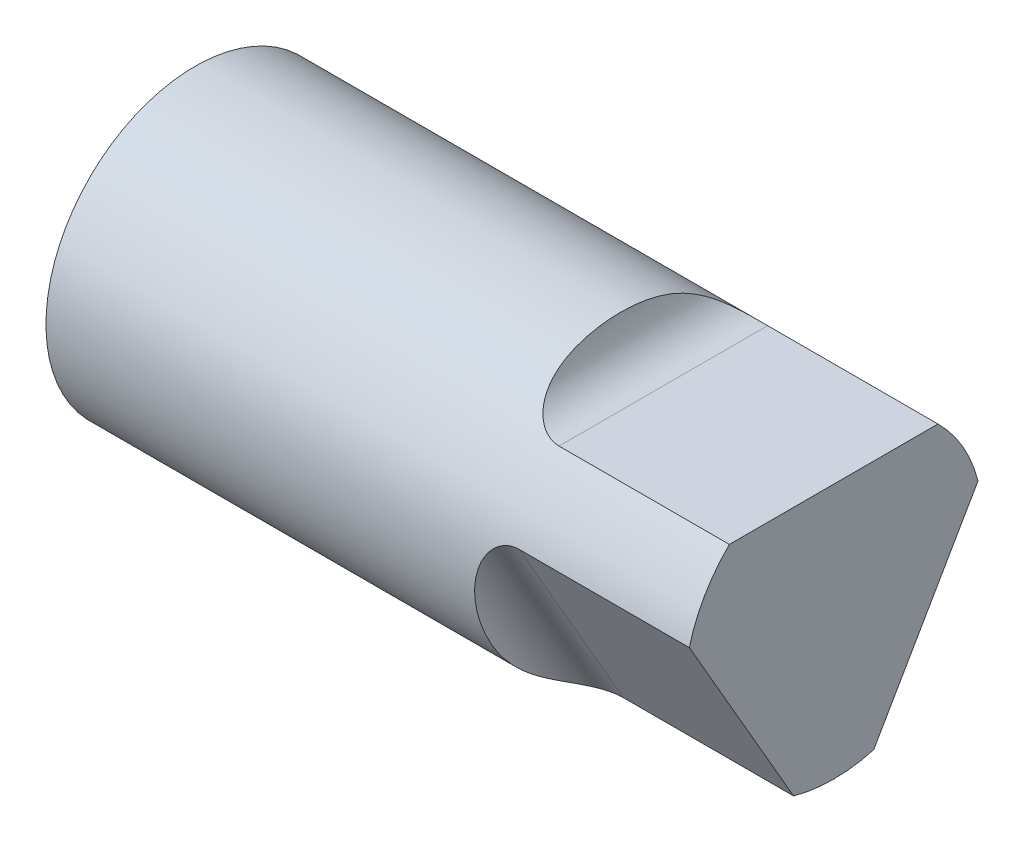
ISO-10303-21;
HEADER;
FILE_DESCRIPTION(('STEP AP214'),'2;1');
FILE_NAME('part.step','',(''),(''),'','','');
FILE_SCHEMA(('AUTOMOTIVE_DESIGN { 1 0 10303 214 1 1 1 1 }'));
ENDSEC;
DATA;
#1=APPLICATION_CONTEXT('core data for automotive mechanical design processes');
#2=APPLICATION_PROTOCOL_DEFINITION('international standard','automotive_design',2000,#1);
#3=PRODUCT_CONTEXT('',#1,'mechanical');
#4=PRODUCT('Part','Part','',(#3));
#5=PRODUCT_RELATED_PRODUCT_CATEGORY('part','',(#4));
#6=PRODUCT_DEFINITION_FORMATION('','',#4);
#7=PRODUCT_DEFINITION_CONTEXT('part definition',#1,'design');
#8=PRODUCT_DEFINITION('design','',#6,#7);
#9=PRODUCT_DEFINITION_SHAPE('','',#8);
#10=(LENGTH_UNIT() NAMED_UNIT(*) SI_UNIT(.MILLI.,.METRE.));
#11=(NAMED_UNIT(*) PLANE_ANGLE_UNIT() SI_UNIT($,.RADIAN.));
#12=(NAMED_UNIT(*) SI_UNIT($,.STERADIAN.) SOLID_ANGLE_UNIT());
#13=UNCERTAINTY_MEASURE_WITH_UNIT(LENGTH_MEASURE(1.E-05),#10,'distance_accuracy_value','');
#14=(GEOMETRIC_REPRESENTATION_CONTEXT(3) GLOBAL_UNCERTAINTY_ASSIGNED_CONTEXT((#13)) GLOBAL_UNIT_ASSIGNED_CONTEXT((#10,
#11,#12)) REPRESENTATION_CONTEXT('',''));
#15=CARTESIAN_POINT('',(0.,0.,0.));
#16=DIRECTION('',(0.,0.,1.));
#17=DIRECTION('',(1.,0.,0.));
#18=AXIS2_PLACEMENT_3D('',#15,#16,#17);
#19=CARTESIAN_POINT('',(60.,0.,0.));
#20=DIRECTION('',(-1.,0.,0.));
#21=DIRECTION('',(0.,0.,1.));
#22=AXIS2_PLACEMENT_3D('',#19,#20,#21);
#23=CYLINDRICAL_SURFACE('',#22,14.);
#24=CARTESIAN_POINT('',(60.,0.,0.));
#25=DIRECTION('',(1.,0.,0.));
#26=DIRECTION('',(0.,0.,-1.));
#27=AXIS2_PLACEMENT_3D('',#24,#25,#26);
#28=CIRCLE('',#27,14.);
#29=CARTESIAN_POINT('',(60.,3.4852813742387,-13.5592335234107));
#30=VERTEX_POINT('',#29);
#31=CARTESIAN_POINT('',(60.,10.,-9.79795897113271));
#32=VERTEX_POINT('',#31);
#33=EDGE_CURVE('E118',#30,#32,#28,.T.);
#34=ORIENTED_EDGE('',*,*,#33,.F.);
#35=DIRECTION('',(-1.,0.,0.));
#36=VECTOR('',#35,1.);
#37=CARTESIAN_POINT('',(60.,3.4852813742387,-13.5592335234107));
#38=LINE('',#37,#36);
#39=CARTESIAN_POINT('',(44.,3.4852813742387,-13.5592335234107));
#40=VERTEX_POINT('',#39);
#41=EDGE_CURVE('E104',#30,#40,#38,.T.);
#42=ORIENTED_EDGE('',*,*,#41,.T.);
#43=CARTESIAN_POINT('',(44.,3.4852813742387,-13.5592335234107));
#44=CARTESIAN_POINT('',(43.9141785661278,3.48530022696564,-13.5592215790291));
#45=CARTESIAN_POINT('',(43.8283678622463,3.48145968499757,-13.5602156867436));
#46=CARTESIAN_POINT('',(43.6575063420808,3.46620484786464,-13.5641268411452));
#47=CARTESIAN_POINT('',(43.572455183019,3.45479416441893,-13.5670429708301));
#48=CARTESIAN_POINT('',(43.4043028178066,3.42463973179134,-13.5746848565925));
#49=CARTESIAN_POINT('',(43.321192667003,3.40594293834388,-13.57939902108));
#50=CARTESIAN_POINT('',(43.1570116428121,3.36149896400591,-13.5904690336366));
#51=CARTESIAN_POINT('',(43.0759409141676,3.33575128422901,-13.5968249978695));
#52=CARTESIAN_POINT('',(42.8368904906767,3.2484987595283,-13.6180342809503));
#53=CARTESIAN_POINT('',(42.6826672315178,3.17690983155402,-13.6350489791986));
#54=CARTESIAN_POINT('',(42.3879020558571,3.01035620579662,-13.6727839427457));
#55=CARTESIAN_POINT('',(42.2473803553689,2.91535767542598,-13.693509559268));
#56=CARTESIAN_POINT('',(41.942799001477,2.67506144527775,-13.7427466435954));
#57=CARTESIAN_POINT('',(41.7840059495909,2.52319094390066,-13.7717526817161));
#58=CARTESIAN_POINT('',(41.4933693354007,2.1952751154083,-13.8278139457392));
#59=CARTESIAN_POINT('',(41.3615663836114,2.01919401566668,-13.8548661928651));
#60=CARTESIAN_POINT('',(41.1579456050866,1.70385208313112,-13.8965618144662));
#61=CARTESIAN_POINT('',(41.079820234268,1.568735719074,-13.9125279674854));
#62=CARTESIAN_POINT('',(40.9352492234473,1.2919861727716,-13.940950634657));
#63=CARTESIAN_POINT('',(40.8688085264248,1.15035026437093,-13.9534056648324));
#64=CARTESIAN_POINT('',(40.7464455239674,0.862180469434536,-13.974174253443));
#65=CARTESIAN_POINT('',(40.6905343593538,0.71564158613619,-13.9824834405062));
#66=CARTESIAN_POINT('',(40.5881072156868,0.419112652578941,-13.9945130537194));
#67=CARTESIAN_POINT('',(40.5415945411802,0.269121409032576,-13.9982318682159));
#68=CARTESIAN_POINT('',(40.4301144295634,-0.128420715093423,-14.0015749531419));
#69=CARTESIAN_POINT('',(40.3719691182032,-0.3779305429581,-13.9971463437073));
#70=CARTESIAN_POINT('',(40.2729708225424,-0.879759760654847,-13.9745932387166));
#71=CARTESIAN_POINT('',(40.2321288719285,-1.1320808382,-13.9564600247138));
#72=CARTESIAN_POINT('',(40.163650677574,-1.63820376406158,-13.9061587416218));
#73=CARTESIAN_POINT('',(40.1360732379485,-1.8920072478217,-13.8739293640238));
#74=CARTESIAN_POINT('',(40.0909944295142,-2.39827247829733,-13.7954309442507));
#75=CARTESIAN_POINT('',(40.073491988429,-2.65073436496361,-13.7491633969509));
#76=CARTESIAN_POINT('',(40.0496440015179,-3.08234531070486,-13.657715425773));
#77=CARTESIAN_POINT('',(40.041544680199,-3.26212404790898,-13.61589613173));
#78=CARTESIAN_POINT('',(40.0282051082732,-3.62000192737098,-13.5251492066459));
#79=CARTESIAN_POINT('',(40.0229650672703,-3.79810094555414,-13.4762210548115));
#80=CARTESIAN_POINT('',(40.0145774328555,-4.15234330135382,-13.3713195455525));
#81=CARTESIAN_POINT('',(40.0114307697299,-4.3284857353302,-13.3153430690125));
#82=CARTESIAN_POINT('',(40.006589102382,-4.67843469443276,-13.1964540102486));
#83=CARTESIAN_POINT('',(40.0048941085985,-4.85224120275262,-13.1335413781511));
#84=CARTESIAN_POINT('',(40.0024419874331,-5.19521473550064,-13.0016577569053));
#85=CARTESIAN_POINT('',(40.0016741264224,-5.36441224480223,-12.9327662007716));
#86=CARTESIAN_POINT('',(40.0006447765915,-5.69998393188856,-12.7884145117315));
#87=CARTESIAN_POINT('',(40.0003832899056,-5.86635809777033,-12.7129543511406));
#88=CARTESIAN_POINT('',(40.0000749515447,-6.19590196669575,-12.5556404289789));
#89=CARTESIAN_POINT('',(40.0000279384366,-6.35907398782879,-12.4737915233966));
#90=CARTESIAN_POINT('',(40.000000715213,-6.68209276943775,-12.3037783656982));
#91=CARTESIAN_POINT('',(40.0000205046691,-6.84193955122958,-12.2156141540815));
#92=CARTESIAN_POINT('',(40.,-6.99999999999989,-12.1243556529822));
#93=B_SPLINE_CURVE_WITH_KNOTS('',3,(#43,#44,#45,#46,#47,#48,#49,#50,#51,#52,#53,#54,#55,#56,#57,
#58,#59,#60,#61,#62,#63,#64,#65,#66,#67,#68,#69,#70,#71,#72,#73,#74,#75,#76,#77,#78,#79,#80,#81,
#82,#83,#84,#85,#86,#87,#88,#89,#90,#91,#92),.UNSPECIFIED.,.F.,.F.,(4,2,2,2,2,2,2,2,2,2,2,2,2,2,
2,2,2,2,2,2,2,2,2,2,4),(0.,0.257354936319275,0.514587176655424,0.770188377509272,
1.02580766813446,1.53582509199969,2.04658398357728,2.70785658459134,3.37011697123741,
3.84018071002146,4.31044282452637,4.78119974051215,5.25212188958807,6.01958121425643,
6.7875291842787,7.55885093421587,8.33009057762474,8.8842012198995,9.43835247669205,
9.99274983123584,10.5471511723816,11.0950705732932,11.6429922836133,12.1905015082119,
12.7380072220073),.UNSPECIFIED.);
#94=CARTESIAN_POINT('',(40.,-6.99999999999989,-12.1243556529822));
#95=VERTEX_POINT('',#94);
#96=EDGE_CURVE('E11',#40,#95,#93,.T.);
#97=ORIENTED_EDGE('',*,*,#96,.T.);
#98=CARTESIAN_POINT('',(40.,-6.99999999999989,-12.1243556529822));
#99=CARTESIAN_POINT('',(40.0000145607828,-7.14577477276903,-12.0401940108974));
#100=CARTESIAN_POINT('',(40.0000003789781,-7.29002945939411,-11.9534017105579));
#101=CARTESIAN_POINT('',(40.0000203514183,-7.57531642026176,-11.7746722078647));
#102=CARTESIAN_POINT('',(40.0000545058613,-7.7163486812894,-11.6827349844174));
#103=CARTESIAN_POINT('',(40.0002770270724,-7.99507428343922,-11.493787369679));
#104=CARTESIAN_POINT('',(40.000465467913,-8.13276598806694,-11.3967745625571));
#105=CARTESIAN_POINT('',(40.0012120440372,-8.40455256671521,-11.1978507943196));
#106=CARTESIAN_POINT('',(40.0017701781917,-8.5386474517197,-11.0959398481646));
#107=CARTESIAN_POINT('',(40.0044181920141,-8.9373782451989,-10.7813941325288));
#108=CARTESIAN_POINT('',(40.0074880241321,-9.19628195071432,-10.5614225223178));
#109=CARTESIAN_POINT('',(40.0195344798431,-9.69726188586028,-10.1033785006117));
#110=CARTESIAN_POINT('',(40.028509137461,-9.93934368659033,-9.86531213697783));
#111=CARTESIAN_POINT('',(40.0533953258265,-10.3449831064958,-9.43633986566008));
#112=CARTESIAN_POINT('',(40.0669108038195,-10.5126500148363,-9.24917187445275));
#113=CARTESIAN_POINT('',(40.1022337187603,-10.8373483118351,-8.86650010997128));
#114=CARTESIAN_POINT('',(40.1240417747048,-10.9943789055182,-8.67099571539662));
#115=CARTESIAN_POINT('',(40.1787733867318,-11.2965627131874,-8.27344060888271));
#116=CARTESIAN_POINT('',(40.2116620031929,-11.441751501491,-8.07141225699713));
#117=CARTESIAN_POINT('',(40.2919925185438,-11.7199044857495,-7.66191835102985));
#118=CARTESIAN_POINT('',(40.3394274533963,-11.8528744919307,-7.45445544211181));
#119=CARTESIAN_POINT('',(40.4318683751842,-12.0588601894252,-7.11390227475764));
#120=CARTESIAN_POINT('',(40.4712810645103,-12.135857541351,-6.98169136472478));
#121=CARTESIAN_POINT('',(40.5585926377566,-12.2843394102011,-6.71699400502845));
#122=CARTESIAN_POINT('',(40.6064891543729,-12.355825457019,-6.58450764239189));
#123=CARTESIAN_POINT('',(40.7119240883714,-12.4929619090369,-6.32044359607757));
#124=CARTESIAN_POINT('',(40.7694556632433,-12.5586164053341,-6.18886533605729));
#125=CARTESIAN_POINT('',(40.8953574960342,-12.6838121611814,-5.92805671731981));
#126=CARTESIAN_POINT('',(40.9637243582936,-12.7433553263551,-5.79882563711772));
#127=CARTESIAN_POINT('',(41.1478521637443,-12.8828170078908,-5.48406094326238));
#128=CARTESIAN_POINT('',(41.2707108776093,-12.9590018007261,-5.30090023620588));
#129=CARTESIAN_POINT('',(41.5455374802278,-13.0964333228992,-4.95162631057308));
#130=CARTESIAN_POINT('',(41.69746124216,-13.1577023810383,-4.78548782843511));
#131=CARTESIAN_POINT('',(41.9969722596584,-13.2537208745737,-4.51170413384462));
#132=CARTESIAN_POINT('',(42.1390051266657,-13.2913333532255,-4.39905967534492));
#133=CARTESIAN_POINT('',(42.3651579527783,-13.34030051618,-4.24726125589991));
#134=CARTESIAN_POINT('',(42.4427804183411,-13.3553882956781,-4.19949792037613));
#135=CARTESIAN_POINT('',(42.6020448767592,-13.3830739245056,-4.11041411919148));
#136=CARTESIAN_POINT('',(42.6836850841695,-13.3956728675891,-4.06909082505688));
#137=CARTESIAN_POINT('',(42.8512588960652,-13.4184842758561,-3.99322750576859));
#138=CARTESIAN_POINT('',(42.9372237503286,-13.428674955556,-3.95874982295634));
#139=CARTESIAN_POINT('',(43.1121207675187,-13.4465312533697,-3.89766737773799));
#140=CARTESIAN_POINT('',(43.2010513506846,-13.4541981928764,-3.8710584960888));
#141=CARTESIAN_POINT('',(43.3809770337262,-13.467010115461,-3.82624903421269));
#142=CARTESIAN_POINT('',(43.4719672239528,-13.472160546132,-3.80803029644765));
#143=CARTESIAN_POINT('',(43.6553182302877,-13.4799708239816,-3.7802906383432));
#144=CARTESIAN_POINT('',(43.7476778108008,-13.4826327922806,-3.770762310624));
#145=CARTESIAN_POINT('',(43.8668676681711,-13.4844644161723,-3.76420238376863));
#146=CARTESIAN_POINT('',(43.8934976089075,-13.4847709658423,-3.76310403049737));
#147=CARTESIAN_POINT('',(43.9467504963331,-13.4851792968541,-3.76164067185537));
#148=CARTESIAN_POINT('',(43.9733734196588,-13.4852812984052,-3.76127487783792));
#149=CARTESIAN_POINT('',(44.,-13.4852813742386,-3.76127455227814));
#150=B_SPLINE_CURVE_WITH_KNOTS('',3,(#98,#99,#100,#101,#102,#103,#104,#105,#106,#107,#108,#109,
#110,#111,#112,#113,#114,#115,#116,#117,#118,#119,#120,#121,#122,#123,#124,#125,#126,#127,#128,
#129,#130,#131,#132,#133,#134,#135,#136,#137,#138,#139,#140,#141,#142,#143,#144,#145,#146,#147,
#148,#149),.UNSPECIFIED.,.F.,.F.,(4,2,2,2,2,2,2,2,2,2,2,2,2,2,2,2,2,2,2,2,2,2,2,2,2,4),(0.,
0.504946875279579,1.00989582093887,1.51508733380293,2.02027730374123,3.03853246408664,
4.05644877414295,4.81095555372186,5.56551866426185,6.31772438779395,7.06957055421651,
7.54327585081987,8.01684917363006,8.49008759496987,8.96317800080699,9.66069308598137,
10.357157482602,10.9101421785481,11.1869916692351,11.4637192225324,11.742861686811,
12.0218577629098,12.3002471786794,12.5783990833825,12.6583549329561,12.7382246585901),.UNSPECIFIED.);
#151=CARTESIAN_POINT('',(44.,-13.4852813742385,-3.76127455227816));
#152=VERTEX_POINT('',#151);
#153=EDGE_CURVE('E46',#95,#152,#150,.T.);
#154=ORIENTED_EDGE('',*,*,#153,.T.);
#155=DIRECTION('',(-1.,0.,0.));
#156=VECTOR('',#155,1.);
#157=CARTESIAN_POINT('',(60.,-13.4852813742385,-3.76127455227816));
#158=LINE('',#157,#156);
#159=CARTESIAN_POINT('',(60.,-13.4852813742385,-3.76127455227816));
#160=VERTEX_POINT('',#159);
#161=EDGE_CURVE('E96',#152,#160,#158,.F.);
#162=ORIENTED_EDGE('',*,*,#161,.T.);
#163=CARTESIAN_POINT('',(60.,-13.4852813742386,3.76127455227798));
#164=VERTEX_POINT('',#163);
#165=EDGE_CURVE('E102',#164,#160,#28,.T.);
#166=ORIENTED_EDGE('',*,*,#165,.F.);
#167=DIRECTION('',(-1.,0.,0.));
#168=VECTOR('',#167,1.);
#169=CARTESIAN_POINT('',(60.,-13.4852813742386,3.76127455227798));
#170=LINE('',#169,#168);
#171=CARTESIAN_POINT('',(44.,-13.4852813742386,3.76127455227798));
#172=VERTEX_POINT('',#171);
#173=EDGE_CURVE('E177',#164,#172,#170,.T.);
#174=ORIENTED_EDGE('',*,*,#173,.T.);
#175=CARTESIAN_POINT('',(44.,-13.4852813742386,3.76127455227798));
#176=CARTESIAN_POINT('',(43.9141785661278,-13.4852804564642,3.76125225314673));
#177=CARTESIAN_POINT('',(43.8283678622463,-13.484221108015,3.76507531391261));
#178=CARTESIAN_POINT('',(43.6575063420808,-13.4799808485184,3.78024196760112));
#179=CARTESIAN_POINT('',(43.572455183019,-13.4768009491834,3.79158197418212));
#180=CARTESIAN_POINT('',(43.4043028178066,-13.4683418000727,3.82151742175551));
#181=CARTESIAN_POINT('',(43.321192667003,-13.4630759895528,3.84006640209408));
#182=CARTESIAN_POINT('',(43.1570116428121,-13.4504409144779,3.88409101919416));
#183=CARTESIAN_POINT('',(43.0759409141676,-13.4430715010807,3.90956714608593));
#184=CARTESIAN_POINT('',(42.8368904906767,-13.4178130166744,3.99573469056147));
#185=CARTESIAN_POINT('',(42.6826672315178,-13.3967537136081,4.06623986994107));
#186=CARTESIAN_POINT('',(42.3879020558571,-13.346156337772,4.2293470227129));
#187=CARTESIAN_POINT('',(42.2473803553689,-13.3166059830041,4.32198097159722));
#188=CARTESIAN_POINT('',(41.942799001477,-13.2390984337658,4.55470215350293));
#189=CARTESIAN_POINT('',(41.7840059495909,-13.1882831489529,4.70072888484132));
#190=CARTESIAN_POINT('',(41.4933693354007,-13.072875713519,5.01274295463026));
#191=CARTESIAN_POINT('',(41.3615663836114,-13.0082630968887,5.17875978369576));
#192=CARTESIAN_POINT('',(41.1579456050866,-12.886701598154,5.47270171895058));
#193=CARTESIAN_POINT('',(41.079820234268,-12.8329705102408,5.59769899920065));
#194=CARTESIAN_POINT('',(40.9352492234473,-12.7192104889036,5.85158247037015));
#195=CARTESIAN_POINT('',(40.8688085264248,-12.65917890724,5.98047028022089));
#196=CARTESIAN_POINT('',(40.7464455239674,-12.5330801351093,6.24041693754448));
#197=CARTESIAN_POINT('',(40.6905343593538,-12.4670066605416,6.37147792665463));
#198=CARTESIAN_POINT('',(40.5881072156868,-12.3291601444034,6.63429432267892));
#199=CARTESIAN_POINT('',(40.5415945411802,-12.2573851104561,6.76604995718355));
#200=CARTESIAN_POINT('',(40.4301144295634,-12.061509244866,7.11200307821408));
#201=CARTESIAN_POINT('',(40.3719691182032,-11.9329190426599,7.32587062292145));
#202=CARTESIAN_POINT('',(40.2729708225424,-11.6624728719554,7.74919092131277));
#203=CARTESIAN_POINT('',(40.2321288719285,-11.5206085092041,7.95864077737574));
#204=CARTESIAN_POINT('',(40.163650677574,-11.2239848572727,8.37180544706356));
#205=CARTESIAN_POINT('',(40.1360732379485,-11.0691716556446,8.57549102276981));
#206=CARTESIAN_POINT('',(40.0909944295142,-10.7480574147263,8.97468036352795));
#207=CARTESIAN_POINT('',(40.073491988429,-10.5817576000608,9.1701849972184));
#208=CARTESIAN_POINT('',(40.0496440015179,-10.2867558610255,9.4982470551928));
#209=CARTESIAN_POINT('',(40.041544680199,-10.1606499214139,9.63303036165033));
#210=CARTESIAN_POINT('',(40.0282051082732,-9.90312183924477,9.89758823417491));
#211=CARTESIAN_POINT('',(40.0229650672703,-9.77169930770434,10.0273624323934));
#212=CARTESIAN_POINT('',(40.0145774328555,-9.50373075789093,10.2816945569829));
#213=CARTESIAN_POINT('',(40.0114307697299,-9.36718249020469,10.4062501412208));
#214=CARTESIAN_POINT('',(40.006589102382,-9.08924706553189,10.6498703004496));
#215=CARTESIAN_POINT('',(40.0048941085985,-8.94785987375653,10.7689348359489));
#216=CARTESIAN_POINT('',(40.0024419874331,-8.6621585410406,11.0000168175115));
#217=CARTESIAN_POINT('',(40.0016741264224,-8.51789794867177,11.1121003807569));
#218=CARTESIAN_POINT('',(40.0006447765915,-8.22509987534069,11.3305381420444));
#219=CARTESIAN_POINT('',(40.0003832899056,-8.07656237635448,11.436892315936));
#220=CARTESIAN_POINT('',(40.0000749515447,-7.77555258893078,11.643628717006));
#221=CARTESIAN_POINT('',(40.0000279384366,-7.62308334685802,11.7440153797029));
#222=CARTESIAN_POINT('',(40.000000715213,-7.3143382425091,11.9387512716265));
#223=CARTESIAN_POINT('',(40.0000205046691,-7.15806240464848,12.0331005395631));
#224=CARTESIAN_POINT('',(40.,-7.00000000000005,12.1243556529821));
#225=B_SPLINE_CURVE_WITH_KNOTS('',3,(#175,#176,#177,#178,#179,#180,#181,#182,#183,#184,#185,
#186,#187,#188,#189,#190,#191,#192,#193,#194,#195,#196,#197,#198,#199,#200,#201,#202,#203,#204,
#205,#206,#207,#208,#209,#210,#211,#212,#213,#214,#215,#216,#217,#218,#219,#220,#221,#222,#223,
#224),.UNSPECIFIED.,.F.,.F.,(4,2,2,2,2,2,2,2,2,2,2,2,2,2,2,2,2,2,2,2,2,2,2,2,4),(0.,
0.257354936319276,0.514587176655425,0.770188377509272,1.02580766813446,1.53582509199969,
2.04658398357728,2.70785658459134,3.3701169712374,3.84018071002146,4.31044282452637,
4.78119974051214,5.25212188958806,6.01958121425642,6.78752918427869,7.55885093421586,
8.33009057762472,8.88420121989949,9.43835247669204,9.99274983123582,10.5471511723816,
11.0950705732932,11.6429922836133,12.1905015082118,12.7380072220073),.UNSPECIFIED.);
#226=CARTESIAN_POINT('',(40.,-7.00000000000006,12.1243556529821));
#227=VERTEX_POINT('',#226);
#228=EDGE_CURVE('E165',#172,#227,#225,.T.);
#229=ORIENTED_EDGE('',*,*,#228,.T.);
#230=CARTESIAN_POINT('',(40.,-7.00000000000006,12.1243556529821));
#231=CARTESIAN_POINT('',(40.0000145607828,-6.8542264935458,12.2085194883887));
#232=CARTESIAN_POINT('',(40.0000003789781,-6.70693481328638,12.2900515614512));
#233=CARTESIAN_POINT('',(40.0000203514183,-6.40950704311449,12.4477525655845));
#234=CARTESIAN_POINT('',(40.0000545058613,-6.25937094154188,12.5239214746639));
#235=CARTESIAN_POINT('',(40.0002770270724,-5.95637470611904,12.6708311194416));
#236=CARTESIAN_POINT('',(40.000465467913,-5.80351329834521,12.7415692299786));
#237=CARTESIAN_POINT('',(40.0012120440372,-5.49534697231089,12.8774814273769));
#238=CARTESIAN_POINT('',(40.0017701781917,-5.34004206151466,12.9426555312308));
#239=CARTESIAN_POINT('',(40.0044181920141,-4.86827208438289,13.130693669837));
#240=CARTESIAN_POINT('',(40.0074880241321,-4.54831922907113,13.2449250508418));
#241=CARTESIAN_POINT('',(40.0195344798431,-3.90115150264906,13.4497643906115));
#242=CARTESIAN_POINT('',(40.028509137461,-3.57393908359052,13.5403801980206));
#243=CARTESIAN_POINT('',(40.0533953258265,-2.99961848915749,13.6771881047763));
#244=CARTESIAN_POINT('',(40.0669108038195,-2.7536927998264,13.7288079111695));
#245=CARTESIAN_POINT('',(40.1022337187603,-2.25994018197505,13.8186690026952));
#246=CARTESIAN_POINT('',(40.1240417747048,-2.01211311288035,13.8569092887088));
#247=CARTESIAN_POINT('',(40.1787733867318,-1.51672838740047,13.9198305895057));
#248=CARTESIAN_POINT('',(40.2116620031929,-1.26917230823103,13.9445535925786));
#249=CARTESIAN_POINT('',(40.2919925185438,-0.775463690839208,13.9806941901012));
#250=CARTESIAN_POINT('',(40.3394274533963,-0.529310538282559,13.9921181389365));
#251=CARTESIAN_POINT('',(40.4318683751842,-0.131389995267357,14.0002304021059));
#252=CARTESIAN_POINT('',(40.4712810645103,0.0216066874414376,14.0008066098813));
#253=CARTESIAN_POINT('',(40.5585926377566,0.325082259678166,13.9970470004587));
#254=CARTESIAN_POINT('',(40.6064891543729,0.475561838785409,13.9927125517009));
#255=CARTESIAN_POINT('',(40.7119240883714,0.772816237128671,13.9794441797761));
#256=CARTESIAN_POINT('',(40.7694556632433,0.919593601040578,13.970513511432));
#257=CARTESIAN_POINT('',(40.8953574960342,1.2080583683168,13.948531907073));
#258=CARTESIAN_POINT('',(40.9637243582936,1.34974734931718,13.9354822606341));
#259=CARTESIAN_POINT('',(41.1478521637443,1.69207241117818,13.8988772727708));
#260=CARTESIAN_POINT('',(41.2707108776093,1.8887866328819,13.87327488522));
#261=CARTESIAN_POINT('',(41.5455374802278,2.25998248644593,13.8176571118863));
#262=CARTESIAN_POINT('',(41.69746124216,2.43449716159316,13.7876484316317));
#263=CARTESIAN_POINT('',(41.9969722596585,2.71961004301818,13.7339110389712));
#264=CARTESIAN_POINT('',(42.1390051266657,2.83596924500037,13.7101621717331));
#265=CARTESIAN_POINT('',(42.3651579527783,2.99191411397134,13.6766697690805));
#266=CARTESIAN_POINT('',(42.4427804183411,3.04082226565344,13.6658545016506));
#267=CARTESIAN_POINT('',(42.6020448767592,3.13181391495878,13.6452890589427));
#268=CARTESIAN_POINT('',(42.6836850841695,3.17390040898916,13.6355384166465));
#269=CARTESIAN_POINT('',(42.8512588960652,3.25100567484173,13.6173620160577));
#270=CARTESIAN_POINT('',(42.9372237503286,3.2859595638707,13.6089485621535));
#271=CARTESIAN_POINT('',(43.1121207675187,3.34778666206194,13.5938713470686));
#272=CARTESIAN_POINT('',(43.2010513506846,3.37466409928977,13.587206670626));
#273=CARTESIAN_POINT('',(43.3809770337262,3.41987619289667,13.5758973901175));
#274=CARTESIAN_POINT('',(43.4719672239528,3.43822929796157,13.5712484250365));
#275=CARTESIAN_POINT('',(43.6553182302877,3.46615768549712,13.5641424950127));
#276=CARTESIAN_POINT('',(43.7476778108007,3.47574044350707,13.5616836633241));
#277=CARTESIAN_POINT('',(43.8668676681711,3.48233731875663,13.5599899327168));
#278=CARTESIAN_POINT('',(43.8934976089075,3.48344179542688,13.5597062358829));
#279=CARTESIAN_POINT('',(43.9467504963331,3.48491326669159,13.5593281815913));
#280=CARTESIAN_POINT('',(43.9733734196588,3.48528105437878,13.559233620517));
#281=CARTESIAN_POINT('',(44.,3.48528137423852,13.5592335234108));
#282=B_SPLINE_CURVE_WITH_KNOTS('',3,(#230,#231,#232,#233,#234,#235,#236,#237,#238,#239,#240,
#241,#242,#243,#244,#245,#246,#247,#248,#249,#250,#251,#252,#253,#254,#255,#256,#257,#258,#259,
#260,#261,#262,#263,#264,#265,#266,#267,#268,#269,#270,#271,#272,#273,#274,#275,#276,#277,#278,
#279,#280,#281),.UNSPECIFIED.,.F.,.F.,(4,2,2,2,2,2,2,2,2,2,2,2,2,2,2,2,2,2,2,2,2,2,2,2,2,4),(0.,
0.50494687527958,1.00989582093887,1.51508733380293,2.02027730374123,3.03853246408664,
4.05644877414295,4.81095555372186,5.56551866426184,6.31772438779394,7.0695705542165,
7.54327585081986,8.01684917363005,8.49008759496985,8.96317800080698,9.66069308598135,
10.357157482602,10.9101421785481,11.186991669235,11.4637192225324,11.742861686811,
12.0218577629098,12.3002471786793,12.5783990833825,12.658354932956,12.7382246585901),.UNSPECIFIED.);
#283=CARTESIAN_POINT('',(44.,3.4852813742385,13.5592335234108));
#284=VERTEX_POINT('',#283);
#285=EDGE_CURVE('E159',#227,#284,#282,.T.);
#286=ORIENTED_EDGE('',*,*,#285,.T.);
#287=DIRECTION('',(-1.,0.,0.));
#288=VECTOR('',#287,1.);
#289=CARTESIAN_POINT('',(60.,3.4852813742385,13.5592335234108));
#290=LINE('',#289,#288);
#291=CARTESIAN_POINT('',(60.,3.4852813742385,13.5592335234108));
#292=VERTEX_POINT('',#291);
#293=EDGE_CURVE('E175',#284,#292,#290,.F.);
#294=ORIENTED_EDGE('',*,*,#293,.T.);
#295=CARTESIAN_POINT('',(60.,10.,9.79795897113271));
#296=VERTEX_POINT('',#295);
#297=EDGE_CURVE('E117',#296,#292,#28,.T.);
#298=ORIENTED_EDGE('',*,*,#297,.F.);
#299=DIRECTION('',(-1.,0.,0.));
#300=VECTOR('',#299,1.);
#301=CARTESIAN_POINT('',(60.,10.,9.79795897113271));
#302=LINE('',#301,#300);
#303=CARTESIAN_POINT('',(44.,10.,9.79795897113271));
#304=VERTEX_POINT('',#303);
#305=EDGE_CURVE('E124',#296,#304,#302,.T.);
#306=ORIENTED_EDGE('',*,*,#305,.T.);
#307=CARTESIAN_POINT('',(44.,10.,9.79795897113271));
#308=CARTESIAN_POINT('',(43.9141785661278,9.99998022949866,9.79796932588239));
#309=CARTESIAN_POINT('',(43.8283678622463,10.0027614230175,9.79514037283097));
#310=CARTESIAN_POINT('',(43.6575063420808,10.0137760006539,9.78388487354405));
#311=CARTESIAN_POINT('',(43.572455183019,10.0220067847646,9.77546099664798));
#312=CARTESIAN_POINT('',(43.4043028178066,10.0437020682814,9.75316743483697));
#313=CARTESIAN_POINT('',(43.321192667003,10.057133051209,9.73933261898594));
#314=CARTESIAN_POINT('',(43.1570116428121,10.0889419504721,9.70637801444238));
#315=CARTESIAN_POINT('',(43.0759409141676,10.1073202168519,9.68725785178353));
#316=CARTESIAN_POINT('',(42.8368904906767,10.1693142571462,9.62229959038879));
#317=CARTESIAN_POINT('',(42.6826672315178,10.2198438820542,9.56880910925755));
#318=CARTESIAN_POINT('',(42.3879020558571,10.3358001319755,9.44343692003274));
#319=CARTESIAN_POINT('',(42.2473803553689,10.4012483075782,9.37152858767073));
#320=CARTESIAN_POINT('',(41.942799001477,10.5640369884882,9.18804449009245));
#321=CARTESIAN_POINT('',(41.7840059495909,10.6650922050524,9.07102379687475));
#322=CARTESIAN_POINT('',(41.4933693354007,10.8776005981108,8.81507099110888));
#323=CARTESIAN_POINT('',(41.3615663836114,10.9890690812221,8.67610640916929));
#324=CARTESIAN_POINT('',(41.1579456050866,11.182849515023,8.42386009551557));
#325=CARTESIAN_POINT('',(41.079820234268,11.2642347911669,8.31482896828473));
#326=CARTESIAN_POINT('',(40.9352492234473,11.4272243161321,8.08936816428685));
#327=CARTESIAN_POINT('',(40.8688085264248,11.5088286428691,7.97293538461145));
#328=CARTESIAN_POINT('',(40.7464455239674,11.6708996656749,7.7337573158985));
#329=CARTESIAN_POINT('',(40.6905343593538,11.7513650744056,7.61100551385151));
#330=CARTESIAN_POINT('',(40.5881072156868,11.9100474918245,7.36021873104043));
#331=CARTESIAN_POINT('',(40.5415945411802,11.9882637014237,7.23218191103231));
#332=CARTESIAN_POINT('',(40.4301144295634,12.1899299599596,6.88957187492776));
#333=CARTESIAN_POINT('',(40.3719691182032,12.3108495856181,6.67127572078574));
#334=CARTESIAN_POINT('',(40.2729708225424,12.5422326326103,6.22540231740376));
#335=CARTESIAN_POINT('',(40.2321288719285,12.6526893474042,5.99781924733799));
#336=CARTESIAN_POINT('',(40.163650677574,12.8621886213343,5.53435329455814));
#337=CARTESIAN_POINT('',(40.1360732379485,12.9611789034664,5.29843834125387));
#338=CARTESIAN_POINT('',(40.0909944295142,13.1463298930238,4.82075058072267));
#339=CARTESIAN_POINT('',(40.073491988429,13.2324919650245,4.57897839973242));
#340=CARTESIAN_POINT('',(40.0496440015179,13.3691011717305,4.15946837058012));
#341=CARTESIAN_POINT('',(40.041544680199,13.4227739693229,3.98286577007954));
#342=CARTESIAN_POINT('',(40.0282051082732,13.5231237666158,3.62756097247092));
#343=CARTESIAN_POINT('',(40.0229650672703,13.5698002532586,3.44885862241802));
#344=CARTESIAN_POINT('',(40.0145774328555,13.6560740592448,3.08962498856958));
#345=CARTESIAN_POINT('',(40.0114307697299,13.695668225535,2.90909292779158));
#346=CARTESIAN_POINT('',(40.006589102382,13.7676817599647,2.54658370979891));
#347=CARTESIAN_POINT('',(40.0048941085985,13.8001010765092,2.36460654220207));
#348=CARTESIAN_POINT('',(40.0024419874331,13.8573732765413,2.0016409393937));
#349=CARTESIAN_POINT('',(40.0016741264224,13.8823101934741,1.82066582001462));
#350=CARTESIAN_POINT('',(40.0006447765915,13.9250838072293,1.457876369687));
#351=CARTESIAN_POINT('',(40.0003832899056,13.9429204741249,1.27606203520452));
#352=CARTESIAN_POINT('',(40.0000749515447,13.9714545556266,0.912011711972853));
#353=CARTESIAN_POINT('',(40.0000279384366,13.9821573346869,0.729776143693629));
#354=CARTESIAN_POINT('',(40.000000715213,13.9964310119469,0.365027094071572));
#355=CARTESIAN_POINT('',(40.0000205046691,14.0000019558781,0.182513614518298));
#356=CARTESIAN_POINT('',(40.,14.,0.));
#357=B_SPLINE_CURVE_WITH_KNOTS('',3,(#307,#308,#309,#310,#311,#312,#313,#314,#315,#316,#317,
#318,#319,#320,#321,#322,#323,#324,#325,#326,#327,#328,#329,#330,#331,#332,#333,#334,#335,#336,
#337,#338,#339,#340,#341,#342,#343,#344,#345,#346,#347,#348,#349,#350,#351,#352,#353,#354,#355,
#356),.UNSPECIFIED.,.F.,.F.,(4,2,2,2,2,2,2,2,2,2,2,2,2,2,2,2,2,2,2,2,2,2,2,2,4),(0.,
0.257354936319276,0.514587176655431,0.770188377509272,1.02580766813446,1.53582509199969,
2.04658398357728,2.70785658459134,3.37011697123741,3.84018071002146,4.31044282452637,
4.78119974051215,5.25212188958807,6.01958121425644,6.7875291842787,7.55885093421588,
8.33009057762474,8.88420121989951,9.43835247669206,9.99274983123584,10.5471511723816,
11.0950705732932,11.6429922836133,12.1905015082119,12.7380072220073),.UNSPECIFIED.);
#358=CARTESIAN_POINT('',(40.,14.,0.));
#359=VERTEX_POINT('',#358);
#360=EDGE_CURVE('E139',#304,#359,#357,.T.);
#361=ORIENTED_EDGE('',*,*,#360,.T.);
#362=CARTESIAN_POINT('',(40.,14.,0.));
#363=CARTESIAN_POINT('',(40.0000145607828,14.0000012663149,-0.168325477491402));
#364=CARTESIAN_POINT('',(40.0000003789781,13.9969642726805,-0.336649850893425));
#365=CARTESIAN_POINT('',(40.0000203514183,13.9848234633763,-0.67308035771986));
#366=CARTESIAN_POINT('',(40.0000545058613,13.9757196228313,-0.841186490246616));
#367=CARTESIAN_POINT('',(40.0002770270724,13.9514489895583,-1.17704374976268));
#368=CARTESIAN_POINT('',(40.000465467913,13.9362792864122,-1.3447946674216));
#369=CARTESIAN_POINT('',(40.0012120440372,13.8998995390261,-1.67963063305739));
#370=CARTESIAN_POINT('',(40.0017701781917,13.8786895132344,-1.84671568306636));
#371=CARTESIAN_POINT('',(40.0044181920141,13.8056503295818,-2.34929953730838));
#372=CARTESIAN_POINT('',(40.0074880241321,13.7446011797855,-2.68350252852413));
#373=CARTESIAN_POINT('',(40.0195344798431,13.5984133885094,-3.34638588999987));
#374=CARTESIAN_POINT('',(40.028509137461,13.5132827701809,-3.67506806104291));
#375=CARTESIAN_POINT('',(40.0533953258265,13.3446015956533,-4.24084823911632));
#376=CARTESIAN_POINT('',(40.0669108038195,13.2663428146627,-4.47963603671684));
#377=CARTESIAN_POINT('',(40.1022337187603,13.0972884938101,-4.95216889272406));
#378=CARTESIAN_POINT('',(40.1240417747048,13.0064920183985,-5.1859135733123));
#379=CARTESIAN_POINT('',(40.1787733867318,12.8132911005879,-5.6463899806231));
#380=CARTESIAN_POINT('',(40.2116620031929,12.7109238097221,-5.87314133558154));
#381=CARTESIAN_POINT('',(40.2919925185438,12.4953681765887,-6.31877583907147));
#382=CARTESIAN_POINT('',(40.3394274533963,12.3821850302133,-6.5376626968248));
#383=CARTESIAN_POINT('',(40.4318683751842,12.1902501846926,-6.88632812734836));
#384=CARTESIAN_POINT('',(40.4712810645103,12.1142508539095,-7.01911524515662));
#385=CARTESIAN_POINT('',(40.5585926377566,11.9592571505229,-7.28005299543035));
#386=CARTESIAN_POINT('',(40.6064891543729,11.8802636182336,-7.40820490930911));
#387=CARTESIAN_POINT('',(40.7119240883714,11.7201456719082,-7.65900058369864));
#388=CARTESIAN_POINT('',(40.7694556632433,11.6390228042935,-7.78164817537481));
#389=CARTESIAN_POINT('',(40.8953574960342,11.4757537928646,-8.02047518975327));
#390=CARTESIAN_POINT('',(40.9637243582936,11.3936079770379,-8.13665662351651));
#391=CARTESIAN_POINT('',(41.1478521637443,11.1907445967126,-8.41481632950857));
#392=CARTESIAN_POINT('',(41.2707108776093,11.0702151678442,-8.57237464901428));
#393=CARTESIAN_POINT('',(41.5455374802278,10.8364508364532,-8.86603080131328));
#394=CARTESIAN_POINT('',(41.69746124216,10.7232052194451,-9.00216060319669));
#395=CARTESIAN_POINT('',(41.9969722596585,10.5341108315555,-9.2222069051267));
#396=CARTESIAN_POINT('',(42.1390051266657,10.4553641082251,-9.31110249638831));
#397=CARTESIAN_POINT('',(42.3651579527783,10.3483864022087,-9.42940851318071));
#398=CARTESIAN_POINT('',(42.4427804183411,10.3145660300246,-9.4663565812746));
#399=CARTESIAN_POINT('',(42.6020448767592,10.2512600095468,-9.53487493975128));
#400=CARTESIAN_POINT('',(42.6836850841695,10.2217724585999,-9.56644759158976));
#401=CARTESIAN_POINT('',(42.8512588960652,10.1674786010143,-9.62413451028923));
#402=CARTESIAN_POINT('',(42.9372237503286,10.1427153916852,-9.65019873919727));
#403=CARTESIAN_POINT('',(43.1121207675187,10.0987445913078,-9.69620396933069));
#404=CARTESIAN_POINT('',(43.2010513506846,10.0795340935866,-9.71614817453735));
#405=CARTESIAN_POINT('',(43.3809770337262,10.0471339225643,-9.74964835590495));
#406=CARTESIAN_POINT('',(43.4719672239528,10.0339312481704,-9.76321812858897));
#407=CARTESIAN_POINT('',(43.6553182302877,10.0138131384844,-9.78385185666956));
#408=CARTESIAN_POINT('',(43.7476778108008,10.0068923487735,-9.79092135270022));
#409=CARTESIAN_POINT('',(43.8668676681711,10.0021270974156,-9.79578754894829));
#410=CARTESIAN_POINT('',(43.8934976089075,10.0013291704154,-9.79660220538566));
#411=CARTESIAN_POINT('',(43.9467504963331,10.0002660301625,-9.79768750973604));
#412=CARTESIAN_POINT('',(43.9733734196588,10.0000002440263,-9.79795874267919));
#413=CARTESIAN_POINT('',(44.,10.,-9.79795897113274));
#414=B_SPLINE_CURVE_WITH_KNOTS('',3,(#362,#363,#364,#365,#366,#367,#368,#369,#370,#371,#372,
#373,#374,#375,#376,#377,#378,#379,#380,#381,#382,#383,#384,#385,#386,#387,#388,#389,#390,#391,
#392,#393,#394,#395,#396,#397,#398,#399,#400,#401,#402,#403,#404,#405,#406,#407,#408,#409,#410,
#411,#412,#413),.UNSPECIFIED.,.F.,.F.,(4,2,2,2,2,2,2,2,2,2,2,2,2,2,2,2,2,2,2,2,2,2,2,2,2,4),(0.,
0.50494687527958,1.00989582093887,1.51508733380293,2.02027730374123,3.03853246408664,
4.05644877414295,4.81095555372186,5.56551866426185,6.31772438779395,7.06957055421651,
7.54327585081987,8.01684917363006,8.49008759496987,8.96317800080699,9.66069308598136,
10.357157482602,10.9101421785481,11.1869916692351,11.4637192225324,11.742861686811,
12.0218577629098,12.3002471786794,12.5783990833825,12.6583549329561,12.7382246585901),.UNSPECIFIED.);
#415=CARTESIAN_POINT('',(44.,10.,-9.79795897113271));
#416=VERTEX_POINT('',#415);
#417=EDGE_CURVE('E133',#359,#416,#414,.T.);
#418=ORIENTED_EDGE('',*,*,#417,.T.);
#419=DIRECTION('',(-1.,0.,0.));
#420=VECTOR('',#419,1.);
#421=CARTESIAN_POINT('',(60.,10.,-9.79795897113271));
#422=LINE('',#421,#420);
#423=EDGE_CURVE('E180',#416,#32,#422,.F.);
#424=ORIENTED_EDGE('',*,*,#423,.T.);
#425=EDGE_LOOP('',(#34,#42,#97,#154,#162,#166,#174,#229,#286,#294,#298,#306,#361,#418,#424));
#426=FACE_BOUND('',#425,.T.);
#427=CARTESIAN_POINT('',(0.,0.,0.));
#428=DIRECTION('',(1.,0.,0.));
#429=DIRECTION('',(0.,0.,-1.));
#430=AXIS2_PLACEMENT_3D('',#427,#428,#429);
#431=CIRCLE('',#430,14.);
#432=CARTESIAN_POINT('',(0.,0.,-14.));
#433=VERTEX_POINT('',#432);
#434=EDGE_CURVE('E121',#433,#433,#431,.T.);
#435=ORIENTED_EDGE('',*,*,#434,.T.);
#436=EDGE_LOOP('',(#435));
#437=FACE_BOUND('',#436,.T.);
#438=ADVANCED_FACE('F33',(#426,#437),#23,.T.);
#439=CARTESIAN_POINT('',(60.,0.,0.));
#440=DIRECTION('',(1.,0.,0.));
#441=DIRECTION('',(0.,0.,-1.));
#442=AXIS2_PLACEMENT_3D('',#439,#440,#441);
#443=PLANE('',#442);
#444=DIRECTION('',(0.,-0.866025403784443,0.499999999999992));
#445=VECTOR('',#444,1.);
#446=CARTESIAN_POINT('',(60.,-4.99999999999992,-8.66025403784443));
#447=LINE('',#446,#445);
#448=EDGE_CURVE('E107',#30,#160,#447,.T.);
#449=ORIENTED_EDGE('',*,*,#448,.F.);
#450=ORIENTED_EDGE('',*,*,#33,.T.);
#451=DIRECTION('',(0.,0.,-1.));
#452=VECTOR('',#451,1.);
#453=CARTESIAN_POINT('',(60.,10.,0.));
#454=LINE('',#453,#452);
#455=EDGE_CURVE('E120',#296,#32,#454,.T.);
#456=ORIENTED_EDGE('',*,*,#455,.F.);
#457=ORIENTED_EDGE('',*,*,#297,.T.);
#458=DIRECTION('',(0.,0.866025403784436,0.500000000000004));
#459=VECTOR('',#458,1.);
#460=CARTESIAN_POINT('',(60.,-5.00000000000004,8.66025403784437));
#461=LINE('',#460,#459);
#462=EDGE_CURVE('E111',#164,#292,#461,.T.);
#463=ORIENTED_EDGE('',*,*,#462,.F.);
#464=ORIENTED_EDGE('',*,*,#165,.T.);
#465=EDGE_LOOP('',(#449,#450,#456,#457,#463,#464));
#466=FACE_BOUND('',#465,.T.);
#467=ADVANCED_FACE('F114',(#466),#443,.T.);
#468=CARTESIAN_POINT('',(0.,0.,0.));
#469=DIRECTION('',(1.,0.,0.));
#470=DIRECTION('',(0.,0.,-1.));
#471=AXIS2_PLACEMENT_3D('',#468,#469,#470);
#472=PLANE('',#471);
#473=ORIENTED_EDGE('',*,*,#434,.F.);
#474=EDGE_LOOP('',(#473));
#475=FACE_BOUND('',#474,.T.);
#476=ADVANCED_FACE('F204',(#475),#472,.F.);
#477=CARTESIAN_POINT('',(40.,10.,-16.));
#478=DIRECTION('',(0.,-1.,0.));
#479=DIRECTION('',(0.,0.,-1.));
#480=AXIS2_PLACEMENT_3D('',#477,#478,#479);
#481=PLANE('',#480);
#482=ORIENTED_EDGE('',*,*,#423,.F.);
#483=DIRECTION('',(0.,0.,-1.));
#484=VECTOR('',#483,1.);
#485=CARTESIAN_POINT('',(44.,10.,9.79795897113271));
#486=LINE('',#485,#484);
#487=EDGE_CURVE('E130',#416,#304,#486,.F.);
#488=ORIENTED_EDGE('',*,*,#487,.T.);
#489=ORIENTED_EDGE('',*,*,#305,.F.);
#490=ORIENTED_EDGE('',*,*,#455,.T.);
#491=EDGE_LOOP('',(#482,#488,#489,#490));
#492=FACE_BOUND('',#491,.T.);
#493=ADVANCED_FACE('F150',(#492),#481,.F.);
#494=CARTESIAN_POINT('',(44.,14.,0.));
#495=DIRECTION('',(0.,0.,1.));
#496=DIRECTION('',(1.,0.,0.));
#497=AXIS2_PLACEMENT_3D('',#494,#495,#496);
#498=CYLINDRICAL_SURFACE('',#497,4.);
#499=ORIENTED_EDGE('',*,*,#360,.F.);
#500=ORIENTED_EDGE('',*,*,#487,.F.);
#501=ORIENTED_EDGE('',*,*,#417,.F.);
#502=EDGE_LOOP('',(#499,#500,#501));
#503=FACE_BOUND('',#502,.T.);
#504=ADVANCED_FACE('F146',(#503),#498,.F.);
#505=CARTESIAN_POINT('',(40.,8.85640646055094,16.6602540378444));
#506=DIRECTION('',(0.,0.500000000000004,-0.866025403784436));
#507=DIRECTION('',(0.,0.866025403784436,0.500000000000004));
#508=AXIS2_PLACEMENT_3D('',#505,#506,#507);
#509=PLANE('',#508);
#510=ORIENTED_EDGE('',*,*,#293,.F.);
#511=DIRECTION('',(0.,0.866025403784436,0.500000000000004));
#512=VECTOR('',#511,1.);
#513=CARTESIAN_POINT('',(44.,-13.4852813742386,3.76127455227797));
#514=LINE('',#513,#512);
#515=EDGE_CURVE('E110',#284,#172,#514,.F.);
#516=ORIENTED_EDGE('',*,*,#515,.T.);
#517=ORIENTED_EDGE('',*,*,#173,.F.);
#518=ORIENTED_EDGE('',*,*,#462,.T.);
#519=EDGE_LOOP('',(#510,#516,#517,#518));
#520=FACE_BOUND('',#519,.T.);
#521=ADVANCED_FACE('F149',(#520),#509,.F.);
#522=CARTESIAN_POINT('',(40.,-18.856406460551,-0.660254037844562));
#523=DIRECTION('',(0.,0.499999999999992,0.866025403784443));
#524=DIRECTION('',(0.,-0.866025403784443,0.499999999999992));
#525=AXIS2_PLACEMENT_3D('',#522,#523,#524);
#526=PLANE('',#525);
#527=ORIENTED_EDGE('',*,*,#161,.F.);
#528=DIRECTION('',(0.,-0.866025403784443,0.499999999999992));
#529=VECTOR('',#528,1.);
#530=CARTESIAN_POINT('',(44.,3.4852813742387,-13.5592335234107));
#531=LINE('',#530,#529);
#532=EDGE_CURVE('E170',#152,#40,#531,.F.);
#533=ORIENTED_EDGE('',*,*,#532,.T.);
#534=ORIENTED_EDGE('',*,*,#41,.F.);
#535=ORIENTED_EDGE('',*,*,#448,.T.);
#536=EDGE_LOOP('',(#527,#533,#534,#535));
#537=FACE_BOUND('',#536,.T.);
#538=ADVANCED_FACE('F108',(#537),#526,.F.);
#539=CARTESIAN_POINT('',(44.,-7.00000000000006,12.1243556529821));
#540=DIRECTION('',(0.,-0.866025403784436,-0.500000000000004));
#541=DIRECTION('',(0.,0.500000000000004,-0.866025403784436));
#542=AXIS2_PLACEMENT_3D('',#539,#540,#541);
#543=CYLINDRICAL_SURFACE('',#542,4.);
#544=ORIENTED_EDGE('',*,*,#228,.F.);
#545=ORIENTED_EDGE('',*,*,#515,.F.);
#546=ORIENTED_EDGE('',*,*,#285,.F.);
#547=EDGE_LOOP('',(#544,#545,#546));
#548=FACE_BOUND('',#547,.T.);
#549=ADVANCED_FACE('F152',(#548),#543,.F.);
#550=CARTESIAN_POINT('',(44.,-6.99999999999989,-12.1243556529822));
#551=DIRECTION('',(0.,0.866025403784443,-0.499999999999992));
#552=DIRECTION('',(0.,0.499999999999992,0.866025403784443));
#553=AXIS2_PLACEMENT_3D('',#550,#551,#552);
#554=CYLINDRICAL_SURFACE('',#553,4.);
#555=ORIENTED_EDGE('',*,*,#96,.F.);
#556=ORIENTED_EDGE('',*,*,#532,.F.);
#557=ORIENTED_EDGE('',*,*,#153,.F.);
#558=EDGE_LOOP('',(#555,#556,#557));
#559=FACE_BOUND('',#558,.T.);
#560=ADVANCED_FACE('F35',(#559),#554,.F.);
#561=CLOSED_SHELL('',(#438,#467,#476,#493,#504,#521,#538,#549,#560));
#562=MANIFOLD_SOLID_BREP('B2',#561);
#563=ADVANCED_BREP_SHAPE_REPRESENTATION('',(#18,#562),#14);
#564=SHAPE_DEFINITION_REPRESENTATION(#9,#563);
ENDSEC;
END-ISO-10303-21;
